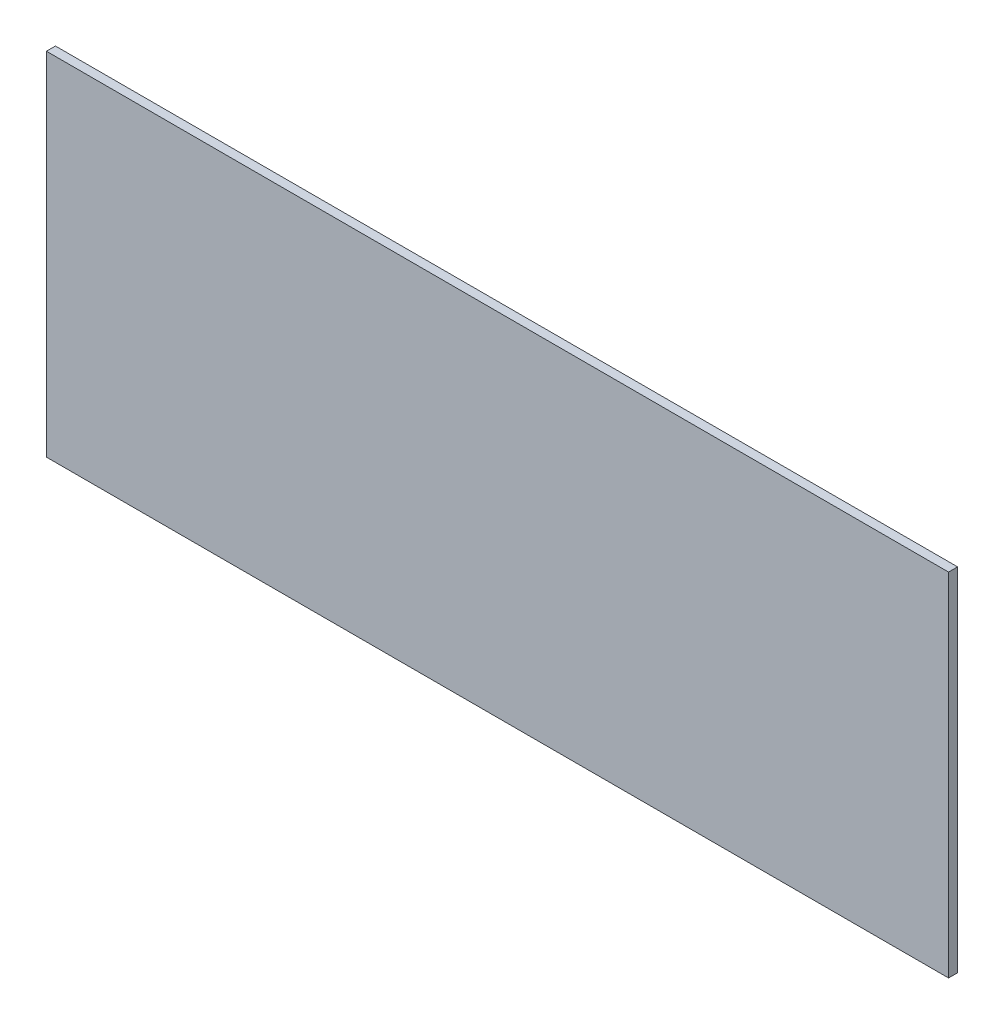
ISO-10303-21;
HEADER;
FILE_DESCRIPTION(('STEP AP214'),'2;1');
FILE_NAME('part.step','',(''),(''),'','','');
FILE_SCHEMA(('AUTOMOTIVE_DESIGN { 1 0 10303 214 1 1 1 1 }'));
ENDSEC;
DATA;
#1=APPLICATION_CONTEXT('core data for automotive mechanical design processes');
#2=APPLICATION_PROTOCOL_DEFINITION('international standard','automotive_design',2000,#1);
#3=PRODUCT_CONTEXT('',#1,'mechanical');
#4=PRODUCT('Part','Part','',(#3));
#5=PRODUCT_RELATED_PRODUCT_CATEGORY('part','',(#4));
#6=PRODUCT_DEFINITION_FORMATION('','',#4);
#7=PRODUCT_DEFINITION_CONTEXT('part definition',#1,'design');
#8=PRODUCT_DEFINITION('design','',#6,#7);
#9=PRODUCT_DEFINITION_SHAPE('','',#8);
#10=(LENGTH_UNIT() NAMED_UNIT(*) SI_UNIT(.MILLI.,.METRE.));
#11=(NAMED_UNIT(*) PLANE_ANGLE_UNIT() SI_UNIT($,.RADIAN.));
#12=(NAMED_UNIT(*) SI_UNIT($,.STERADIAN.) SOLID_ANGLE_UNIT());
#13=UNCERTAINTY_MEASURE_WITH_UNIT(LENGTH_MEASURE(1.E-05),#10,'distance_accuracy_value','');
#14=(GEOMETRIC_REPRESENTATION_CONTEXT(3) GLOBAL_UNCERTAINTY_ASSIGNED_CONTEXT((#13)) GLOBAL_UNIT_ASSIGNED_CONTEXT((#10,
#11,#12)) REPRESENTATION_CONTEXT('',''));
#15=CARTESIAN_POINT('',(0.,0.,0.));
#16=DIRECTION('',(0.,0.,1.));
#17=DIRECTION('',(1.,0.,0.));
#18=AXIS2_PLACEMENT_3D('',#15,#16,#17);
#19=CARTESIAN_POINT('',(0.,0.,3.));
#20=DIRECTION('',(1.,0.,0.));
#21=DIRECTION('',(0.,0.,-1.));
#22=AXIS2_PLACEMENT_3D('',#19,#20,#21);
#23=PLANE('',#22);
#24=DIRECTION('',(0.,-1.,0.));
#25=VECTOR('',#24,1.);
#26=CARTESIAN_POINT('',(0.,0.,0.));
#27=LINE('',#26,#25);
#28=CARTESIAN_POINT('',(0.,116.9,0.));
#29=VERTEX_POINT('',#28);
#30=CARTESIAN_POINT('',(0.,0.,0.));
#31=VERTEX_POINT('',#30);
#32=EDGE_CURVE('E102',#29,#31,#27,.T.);
#33=ORIENTED_EDGE('',*,*,#32,.T.);
#34=DIRECTION('',(0.,0.,-1.));
#35=VECTOR('',#34,1.);
#36=CARTESIAN_POINT('',(0.,0.,3.));
#37=LINE('',#36,#35);
#38=CARTESIAN_POINT('',(0.,0.,3.));
#39=VERTEX_POINT('',#38);
#40=EDGE_CURVE('E11',#39,#31,#37,.T.);
#41=ORIENTED_EDGE('',*,*,#40,.F.);
#42=DIRECTION('',(0.,-1.,0.));
#43=VECTOR('',#42,1.);
#44=CARTESIAN_POINT('',(0.,0.,3.));
#45=LINE('',#44,#43);
#46=CARTESIAN_POINT('',(0.,116.9,3.));
#47=VERTEX_POINT('',#46);
#48=EDGE_CURVE('E90',#47,#39,#45,.T.);
#49=ORIENTED_EDGE('',*,*,#48,.F.);
#50=DIRECTION('',(0.,0.,-1.));
#51=VECTOR('',#50,1.);
#52=CARTESIAN_POINT('',(0.,116.9,3.));
#53=LINE('',#52,#51);
#54=EDGE_CURVE('E98',#47,#29,#53,.T.);
#55=ORIENTED_EDGE('',*,*,#54,.T.);
#56=EDGE_LOOP('',(#33,#41,#49,#55));
#57=FACE_BOUND('',#56,.T.);
#58=ADVANCED_FACE('F39',(#57),#23,.F.);
#59=CARTESIAN_POINT('',(0.,0.,3.));
#60=DIRECTION('',(0.,1.,0.));
#61=DIRECTION('',(0.,0.,1.));
#62=AXIS2_PLACEMENT_3D('',#59,#60,#61);
#63=PLANE('',#62);
#64=DIRECTION('',(1.,0.,0.));
#65=VECTOR('',#64,1.);
#66=CARTESIAN_POINT('',(0.,0.,0.));
#67=LINE('',#66,#65);
#68=CARTESIAN_POINT('',(300.,0.,0.));
#69=VERTEX_POINT('',#68);
#70=EDGE_CURVE('E94',#31,#69,#67,.T.);
#71=ORIENTED_EDGE('',*,*,#70,.T.);
#72=DIRECTION('',(0.,0.,-1.));
#73=VECTOR('',#72,1.);
#74=CARTESIAN_POINT('',(300.,0.,3.));
#75=LINE('',#74,#73);
#76=CARTESIAN_POINT('',(300.,0.,3.));
#77=VERTEX_POINT('',#76);
#78=EDGE_CURVE('E47',#77,#69,#75,.T.);
#79=ORIENTED_EDGE('',*,*,#78,.F.);
#80=DIRECTION('',(1.,0.,0.));
#81=VECTOR('',#80,1.);
#82=CARTESIAN_POINT('',(0.,0.,3.));
#83=LINE('',#82,#81);
#84=EDGE_CURVE('E85',#39,#77,#83,.T.);
#85=ORIENTED_EDGE('',*,*,#84,.F.);
#86=ORIENTED_EDGE('',*,*,#40,.T.);
#87=EDGE_LOOP('',(#71,#79,#85,#86));
#88=FACE_BOUND('',#87,.T.);
#89=ADVANCED_FACE('F93',(#88),#63,.F.);
#90=CARTESIAN_POINT('',(300.,0.,3.));
#91=DIRECTION('',(-1.,0.,0.));
#92=DIRECTION('',(0.,-1.,0.));
#93=AXIS2_PLACEMENT_3D('',#90,#91,#92);
#94=PLANE('',#93);
#95=DIRECTION('',(0.,1.,0.));
#96=VECTOR('',#95,1.);
#97=CARTESIAN_POINT('',(300.,0.,0.));
#98=LINE('',#97,#96);
#99=CARTESIAN_POINT('',(300.,116.9,0.));
#100=VERTEX_POINT('',#99);
#101=EDGE_CURVE('E72',#69,#100,#98,.T.);
#102=ORIENTED_EDGE('',*,*,#101,.T.);
#103=DIRECTION('',(0.,0.,-1.));
#104=VECTOR('',#103,1.);
#105=CARTESIAN_POINT('',(300.,116.9,3.));
#106=LINE('',#105,#104);
#107=CARTESIAN_POINT('',(300.,116.9,3.));
#108=VERTEX_POINT('',#107);
#109=EDGE_CURVE('E95',#108,#100,#106,.T.);
#110=ORIENTED_EDGE('',*,*,#109,.F.);
#111=DIRECTION('',(0.,1.,0.));
#112=VECTOR('',#111,1.);
#113=CARTESIAN_POINT('',(300.,0.,3.));
#114=LINE('',#113,#112);
#115=EDGE_CURVE('E88',#77,#108,#114,.T.);
#116=ORIENTED_EDGE('',*,*,#115,.F.);
#117=ORIENTED_EDGE('',*,*,#78,.T.);
#118=EDGE_LOOP('',(#102,#110,#116,#117));
#119=FACE_BOUND('',#118,.T.);
#120=ADVANCED_FACE('F96',(#119),#94,.F.);
#121=CARTESIAN_POINT('',(0.,116.9,3.));
#122=DIRECTION('',(0.,-1.,0.));
#123=DIRECTION('',(0.,0.,-1.));
#124=AXIS2_PLACEMENT_3D('',#121,#122,#123);
#125=PLANE('',#124);
#126=DIRECTION('',(-1.,0.,0.));
#127=VECTOR('',#126,1.);
#128=CARTESIAN_POINT('',(0.,116.9,0.));
#129=LINE('',#128,#127);
#130=EDGE_CURVE('E78',#100,#29,#129,.T.);
#131=ORIENTED_EDGE('',*,*,#130,.T.);
#132=ORIENTED_EDGE('',*,*,#54,.F.);
#133=DIRECTION('',(-1.,0.,0.));
#134=VECTOR('',#133,1.);
#135=CARTESIAN_POINT('',(0.,116.9,3.));
#136=LINE('',#135,#134);
#137=EDGE_CURVE('E55',#108,#47,#136,.T.);
#138=ORIENTED_EDGE('',*,*,#137,.F.);
#139=ORIENTED_EDGE('',*,*,#109,.T.);
#140=EDGE_LOOP('',(#131,#132,#138,#139));
#141=FACE_BOUND('',#140,.T.);
#142=ADVANCED_FACE('F109',(#141),#125,.F.);
#143=CARTESIAN_POINT('',(0.,0.,3.));
#144=DIRECTION('',(0.,0.,-1.));
#145=DIRECTION('',(-1.,0.,0.));
#146=AXIS2_PLACEMENT_3D('',#143,#144,#145);
#147=PLANE('',#146);
#148=ORIENTED_EDGE('',*,*,#48,.T.);
#149=ORIENTED_EDGE('',*,*,#84,.T.);
#150=ORIENTED_EDGE('',*,*,#115,.T.);
#151=ORIENTED_EDGE('',*,*,#137,.T.);
#152=EDGE_LOOP('',(#148,#149,#150,#151));
#153=FACE_BOUND('',#152,.T.);
#154=ADVANCED_FACE('F86',(#153),#147,.F.);
#155=CARTESIAN_POINT('',(0.,0.,0.));
#156=DIRECTION('',(0.,0.,-1.));
#157=DIRECTION('',(-1.,0.,0.));
#158=AXIS2_PLACEMENT_3D('',#155,#156,#157);
#159=PLANE('',#158);
#160=ORIENTED_EDGE('',*,*,#32,.F.);
#161=ORIENTED_EDGE('',*,*,#130,.F.);
#162=ORIENTED_EDGE('',*,*,#101,.F.);
#163=ORIENTED_EDGE('',*,*,#70,.F.);
#164=EDGE_LOOP('',(#160,#161,#162,#163));
#165=FACE_BOUND('',#164,.T.);
#166=ADVANCED_FACE('F112',(#165),#159,.T.);
#167=CLOSED_SHELL('',(#58,#89,#120,#142,#154,#166));
#168=MANIFOLD_SOLID_BREP('B2',#167);
#169=ADVANCED_BREP_SHAPE_REPRESENTATION('',(#18,#168),#14);
#170=SHAPE_DEFINITION_REPRESENTATION(#9,#169);
ENDSEC;
END-ISO-10303-21;
